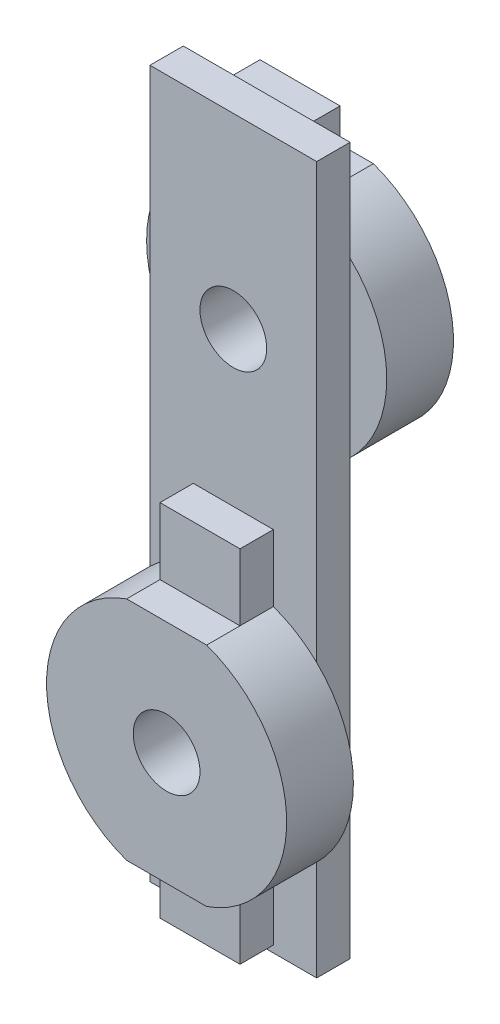
ISO-10303-21;
HEADER;
FILE_DESCRIPTION(('STEP AP214'),'2;1');
FILE_NAME('part.step','',(''),(''),'','','');
FILE_SCHEMA(('AUTOMOTIVE_DESIGN { 1 0 10303 214 1 1 1 1 }'));
ENDSEC;
DATA;
#1=APPLICATION_CONTEXT('core data for automotive mechanical design processes');
#2=APPLICATION_PROTOCOL_DEFINITION('international standard','automotive_design',2000,#1);
#3=PRODUCT_CONTEXT('',#1,'mechanical');
#4=PRODUCT('Part','Part','',(#3));
#5=PRODUCT_RELATED_PRODUCT_CATEGORY('part','',(#4));
#6=PRODUCT_DEFINITION_FORMATION('','',#4);
#7=PRODUCT_DEFINITION_CONTEXT('part definition',#1,'design');
#8=PRODUCT_DEFINITION('design','',#6,#7);
#9=PRODUCT_DEFINITION_SHAPE('','',#8);
#10=(LENGTH_UNIT() NAMED_UNIT(*) SI_UNIT(.MILLI.,.METRE.));
#11=(NAMED_UNIT(*) PLANE_ANGLE_UNIT() SI_UNIT($,.RADIAN.));
#12=(NAMED_UNIT(*) SI_UNIT($,.STERADIAN.) SOLID_ANGLE_UNIT());
#13=UNCERTAINTY_MEASURE_WITH_UNIT(LENGTH_MEASURE(1.E-05),#10,'distance_accuracy_value','');
#14=(GEOMETRIC_REPRESENTATION_CONTEXT(3) GLOBAL_UNCERTAINTY_ASSIGNED_CONTEXT((#13)) GLOBAL_UNIT_ASSIGNED_CONTEXT((#10,
#11,#12)) REPRESENTATION_CONTEXT('',''));
#15=CARTESIAN_POINT('',(0.,0.,0.));
#16=DIRECTION('',(0.,0.,1.));
#17=DIRECTION('',(1.,0.,0.));
#18=AXIS2_PLACEMENT_3D('',#15,#16,#17);
#19=CARTESIAN_POINT('',(0.,0.,0.));
#20=DIRECTION('',(0.,0.,1.));
#21=DIRECTION('',(1.,0.,0.));
#22=AXIS2_PLACEMENT_3D('',#19,#20,#21);
#23=PLANE('',#22);
#24=CARTESIAN_POINT('',(0.,-22.,0.));
#25=DIRECTION('',(0.,0.,-1.));
#26=DIRECTION('',(-1.,0.,0.));
#27=AXIS2_PLACEMENT_3D('',#24,#25,#26);
#28=CIRCLE('',#27,5.);
#29=CARTESIAN_POINT('',(-5.,-22.,0.));
#30=VERTEX_POINT('',#29);
#31=EDGE_CURVE('E478',#30,#30,#28,.T.);
#32=ORIENTED_EDGE('',*,*,#31,.F.);
#33=EDGE_LOOP('',(#32));
#34=FACE_BOUND('',#33,.T.);
#35=CARTESIAN_POINT('',(0.,28.,0.));
#36=DIRECTION('',(0.,0.,-1.));
#37=DIRECTION('',(-1.,0.,0.));
#38=AXIS2_PLACEMENT_3D('',#35,#36,#37);
#39=CIRCLE('',#38,18.);
#40=CARTESIAN_POINT('',(12.5,15.0481661530114,0.));
#41=VERTEX_POINT('',#40);
#42=CARTESIAN_POINT('',(6.,11.0294372515229,0.));
#43=VERTEX_POINT('',#42);
#44=EDGE_CURVE('E12',#41,#43,#39,.T.);
#45=ORIENTED_EDGE('',*,*,#44,.F.);
#46=DIRECTION('',(0.,1.,0.));
#47=VECTOR('',#46,1.);
#48=CARTESIAN_POINT('',(12.5,56.,0.));
#49=LINE('',#48,#47);
#50=CARTESIAN_POINT('',(12.5,-50.,0.));
#51=VERTEX_POINT('',#50);
#52=EDGE_CURVE('E341',#51,#41,#49,.T.);
#53=ORIENTED_EDGE('',*,*,#52,.F.);
#54=DIRECTION('',(1.,0.,0.));
#55=VECTOR('',#54,1.);
#56=CARTESIAN_POINT('',(-12.5,-50.,0.));
#57=LINE('',#56,#55);
#58=CARTESIAN_POINT('',(-12.5,-50.,0.));
#59=VERTEX_POINT('',#58);
#60=EDGE_CURVE('E351',#59,#51,#57,.T.);
#61=ORIENTED_EDGE('',*,*,#60,.F.);
#62=DIRECTION('',(0.,-1.,0.));
#63=VECTOR('',#62,1.);
#64=CARTESIAN_POINT('',(-12.5,56.,0.));
#65=LINE('',#64,#63);
#66=CARTESIAN_POINT('',(-12.5,15.0481661530114,0.));
#67=VERTEX_POINT('',#66);
#68=EDGE_CURVE('E347',#67,#59,#65,.T.);
#69=ORIENTED_EDGE('',*,*,#68,.F.);
#70=CARTESIAN_POINT('',(0.,28.,0.));
#71=DIRECTION('',(0.,0.,-1.));
#72=DIRECTION('',(-1.,0.,0.));
#73=AXIS2_PLACEMENT_3D('',#70,#71,#72);
#74=CIRCLE('',#73,18.);
#75=CARTESIAN_POINT('',(-6.,11.0294372515229,0.));
#76=VERTEX_POINT('',#75);
#77=EDGE_CURVE('E511',#76,#67,#74,.T.);
#78=ORIENTED_EDGE('',*,*,#77,.F.);
#79=DIRECTION('',(0.,-1.,0.));
#80=VECTOR('',#79,1.);
#81=CARTESIAN_POINT('',(-6.,0.,0.));
#82=LINE('',#81,#80);
#83=CARTESIAN_POINT('',(-6.,1.02943725152286,0.));
#84=VERTEX_POINT('',#83);
#85=EDGE_CURVE('E494',#76,#84,#82,.T.);
#86=ORIENTED_EDGE('',*,*,#85,.T.);
#87=DIRECTION('',(1.,0.,0.));
#88=VECTOR('',#87,1.);
#89=CARTESIAN_POINT('',(0.,1.02943725152286,0.));
#90=LINE('',#89,#88);
#91=CARTESIAN_POINT('',(6.,1.02943725152286,0.));
#92=VERTEX_POINT('',#91);
#93=EDGE_CURVE('E501',#84,#92,#90,.T.);
#94=ORIENTED_EDGE('',*,*,#93,.T.);
#95=DIRECTION('',(0.,1.,0.));
#96=VECTOR('',#95,1.);
#97=CARTESIAN_POINT('',(6.,0.,0.));
#98=LINE('',#97,#96);
#99=EDGE_CURVE('E524',#92,#43,#98,.T.);
#100=ORIENTED_EDGE('',*,*,#99,.T.);
#101=EDGE_LOOP('',(#45,#53,#61,#69,#78,#86,#94,#100));
#102=FACE_BOUND('',#101,.T.);
#103=ADVANCED_FACE('F95',(#34,#102),#23,.F.);
#104=CARTESIAN_POINT('',(0.,0.,5.));
#105=DIRECTION('',(0.,0.,1.));
#106=DIRECTION('',(1.,0.,0.));
#107=AXIS2_PLACEMENT_3D('',#104,#105,#106);
#108=PLANE('',#107);
#109=CARTESIAN_POINT('',(0.,-22.,5.));
#110=DIRECTION('',(0.,0.,1.));
#111=DIRECTION('',(1.,0.,0.));
#112=AXIS2_PLACEMENT_3D('',#109,#110,#111);
#113=CIRCLE('',#112,18.);
#114=CARTESIAN_POINT('',(6.00000000000001,-38.9705627484771,5.));
#115=VERTEX_POINT('',#114);
#116=CARTESIAN_POINT('',(12.5,-34.9518338469886,5.));
#117=VERTEX_POINT('',#116);
#118=EDGE_CURVE('E372',#115,#117,#113,.T.);
#119=ORIENTED_EDGE('',*,*,#118,.F.);
#120=DIRECTION('',(0.,1.,0.));
#121=VECTOR('',#120,1.);
#122=CARTESIAN_POINT('',(6.00000000000001,0.,5.));
#123=LINE('',#122,#121);
#124=CARTESIAN_POINT('',(6.00000000000001,-48.9705627484771,5.));
#125=VERTEX_POINT('',#124);
#126=EDGE_CURVE('E401',#125,#115,#123,.T.);
#127=ORIENTED_EDGE('',*,*,#126,.F.);
#128=DIRECTION('',(1.,0.,0.));
#129=VECTOR('',#128,1.);
#130=CARTESIAN_POINT('',(0.,-48.9705627484771,5.));
#131=LINE('',#130,#129);
#132=CARTESIAN_POINT('',(-5.99999999999998,-48.9705627484771,5.));
#133=VERTEX_POINT('',#132);
#134=EDGE_CURVE('E446',#133,#125,#131,.T.);
#135=ORIENTED_EDGE('',*,*,#134,.F.);
#136=DIRECTION('',(0.,-1.,0.));
#137=VECTOR('',#136,1.);
#138=CARTESIAN_POINT('',(-5.99999999999998,0.,5.));
#139=LINE('',#138,#137);
#140=CARTESIAN_POINT('',(-5.99999999999998,-38.9705627484771,5.));
#141=VERTEX_POINT('',#140);
#142=EDGE_CURVE('E442',#141,#133,#139,.T.);
#143=ORIENTED_EDGE('',*,*,#142,.F.);
#144=CARTESIAN_POINT('',(0.,-22.,5.));
#145=DIRECTION('',(0.,0.,1.));
#146=DIRECTION('',(1.,0.,0.));
#147=AXIS2_PLACEMENT_3D('',#144,#145,#146);
#148=CIRCLE('',#147,18.);
#149=CARTESIAN_POINT('',(-12.5,-34.9518338469886,5.));
#150=VERTEX_POINT('',#149);
#151=EDGE_CURVE('E370',#150,#141,#148,.T.);
#152=ORIENTED_EDGE('',*,*,#151,.F.);
#153=DIRECTION('',(0.,-1.,0.));
#154=VECTOR('',#153,1.);
#155=CARTESIAN_POINT('',(-12.5,56.,5.));
#156=LINE('',#155,#154);
#157=CARTESIAN_POINT('',(-12.5,-50.,5.));
#158=VERTEX_POINT('',#157);
#159=EDGE_CURVE('E333',#150,#158,#156,.T.);
#160=ORIENTED_EDGE('',*,*,#159,.T.);
#161=DIRECTION('',(1.,0.,0.));
#162=VECTOR('',#161,1.);
#163=CARTESIAN_POINT('',(-12.5,-50.,5.));
#164=LINE('',#163,#162);
#165=CARTESIAN_POINT('',(12.5,-50.,5.));
#166=VERTEX_POINT('',#165);
#167=EDGE_CURVE('E337',#158,#166,#164,.T.);
#168=ORIENTED_EDGE('',*,*,#167,.T.);
#169=DIRECTION('',(0.,1.,0.));
#170=VECTOR('',#169,1.);
#171=CARTESIAN_POINT('',(12.5,56.,5.));
#172=LINE('',#171,#170);
#173=EDGE_CURVE('E326',#166,#117,#172,.T.);
#174=ORIENTED_EDGE('',*,*,#173,.T.);
#175=EDGE_LOOP('',(#119,#127,#135,#143,#152,#160,#168,#174));
#176=FACE_BOUND('',#175,.T.);
#177=ADVANCED_FACE('F444',(#176),#108,.T.);
#178=CARTESIAN_POINT('',(12.5,56.,5.));
#179=DIRECTION('',(-1.,0.,0.));
#180=DIRECTION('',(0.,-1.,0.));
#181=AXIS2_PLACEMENT_3D('',#178,#179,#180);
#182=PLANE('',#181);
#183=ORIENTED_EDGE('',*,*,#52,.T.);
#184=CARTESIAN_POINT('',(12.5,40.9518338469886,0.));
#185=VERTEX_POINT('',#184);
#186=EDGE_CURVE('E345',#41,#185,#49,.T.);
#187=ORIENTED_EDGE('',*,*,#186,.T.);
#188=CARTESIAN_POINT('',(12.5,56.,0.));
#189=VERTEX_POINT('',#188);
#190=EDGE_CURVE('E325',#185,#189,#49,.T.);
#191=ORIENTED_EDGE('',*,*,#190,.T.);
#192=DIRECTION('',(0.,0.,-1.));
#193=VECTOR('',#192,1.);
#194=CARTESIAN_POINT('',(12.5,56.,5.));
#195=LINE('',#194,#193);
#196=CARTESIAN_POINT('',(12.5,56.,5.));
#197=VERTEX_POINT('',#196);
#198=EDGE_CURVE('E99',#197,#189,#195,.T.);
#199=ORIENTED_EDGE('',*,*,#198,.F.);
#200=CARTESIAN_POINT('',(12.5,-9.04816615301135,5.));
#201=VERTEX_POINT('',#200);
#202=EDGE_CURVE('E331',#201,#197,#172,.T.);
#203=ORIENTED_EDGE('',*,*,#202,.F.);
#204=EDGE_CURVE('E330',#117,#201,#172,.T.);
#205=ORIENTED_EDGE('',*,*,#204,.F.);
#206=ORIENTED_EDGE('',*,*,#173,.F.);
#207=DIRECTION('',(0.,0.,-1.));
#208=VECTOR('',#207,1.);
#209=CARTESIAN_POINT('',(12.5,-50.,5.));
#210=LINE('',#209,#208);
#211=EDGE_CURVE('E340',#166,#51,#210,.T.);
#212=ORIENTED_EDGE('',*,*,#211,.T.);
#213=EDGE_LOOP('',(#183,#187,#191,#199,#203,#205,#206,#212));
#214=FACE_BOUND('',#213,.T.);
#215=ADVANCED_FACE('F97',(#214),#182,.F.);
#216=CARTESIAN_POINT('',(-12.5,56.,5.));
#217=DIRECTION('',(0.,-1.,0.));
#218=DIRECTION('',(0.,0.,-1.));
#219=AXIS2_PLACEMENT_3D('',#216,#217,#218);
#220=PLANE('',#219);
#221=DIRECTION('',(-1.,0.,0.));
#222=VECTOR('',#221,1.);
#223=CARTESIAN_POINT('',(-12.5,56.,0.));
#224=LINE('',#223,#222);
#225=CARTESIAN_POINT('',(-12.5,56.,0.));
#226=VERTEX_POINT('',#225);
#227=EDGE_CURVE('E344',#189,#226,#224,.T.);
#228=ORIENTED_EDGE('',*,*,#227,.T.);
#229=DIRECTION('',(0.,0.,-1.));
#230=VECTOR('',#229,1.);
#231=CARTESIAN_POINT('',(-12.5,56.,5.));
#232=LINE('',#231,#230);
#233=CARTESIAN_POINT('',(-12.5,56.,5.));
#234=VERTEX_POINT('',#233);
#235=EDGE_CURVE('E358',#234,#226,#232,.T.);
#236=ORIENTED_EDGE('',*,*,#235,.F.);
#237=DIRECTION('',(-1.,0.,0.));
#238=VECTOR('',#237,1.);
#239=CARTESIAN_POINT('',(-12.5,56.,5.));
#240=LINE('',#239,#238);
#241=EDGE_CURVE('E329',#197,#234,#240,.T.);
#242=ORIENTED_EDGE('',*,*,#241,.F.);
#243=ORIENTED_EDGE('',*,*,#198,.T.);
#244=EDGE_LOOP('',(#228,#236,#242,#243));
#245=FACE_BOUND('',#244,.T.);
#246=ADVANCED_FACE('F944',(#245),#220,.F.);
#247=CARTESIAN_POINT('',(-12.5,56.,5.));
#248=DIRECTION('',(1.,0.,0.));
#249=DIRECTION('',(0.,1.,0.));
#250=AXIS2_PLACEMENT_3D('',#247,#248,#249);
#251=PLANE('',#250);
#252=CARTESIAN_POINT('',(-12.5,40.9518338469886,0.));
#253=VERTEX_POINT('',#252);
#254=EDGE_CURVE('E348',#226,#253,#65,.T.);
#255=ORIENTED_EDGE('',*,*,#254,.T.);
#256=EDGE_CURVE('E352',#253,#67,#65,.T.);
#257=ORIENTED_EDGE('',*,*,#256,.T.);
#258=ORIENTED_EDGE('',*,*,#68,.T.);
#259=DIRECTION('',(0.,0.,-1.));
#260=VECTOR('',#259,1.);
#261=CARTESIAN_POINT('',(-12.5,-50.,5.));
#262=LINE('',#261,#260);
#263=EDGE_CURVE('E356',#158,#59,#262,.T.);
#264=ORIENTED_EDGE('',*,*,#263,.F.);
#265=ORIENTED_EDGE('',*,*,#159,.F.);
#266=CARTESIAN_POINT('',(-12.5,-9.04816615301139,5.));
#267=VERTEX_POINT('',#266);
#268=EDGE_CURVE('E338',#267,#150,#156,.T.);
#269=ORIENTED_EDGE('',*,*,#268,.F.);
#270=EDGE_CURVE('E334',#234,#267,#156,.T.);
#271=ORIENTED_EDGE('',*,*,#270,.F.);
#272=ORIENTED_EDGE('',*,*,#235,.T.);
#273=EDGE_LOOP('',(#255,#257,#258,#264,#265,#269,#271,#272));
#274=FACE_BOUND('',#273,.T.);
#275=ADVANCED_FACE('F569',(#274),#251,.F.);
#276=CARTESIAN_POINT('',(-12.5,-50.,5.));
#277=DIRECTION('',(0.,1.,0.));
#278=DIRECTION('',(0.,0.,1.));
#279=AXIS2_PLACEMENT_3D('',#276,#277,#278);
#280=PLANE('',#279);
#281=ORIENTED_EDGE('',*,*,#60,.T.);
#282=ORIENTED_EDGE('',*,*,#211,.F.);
#283=ORIENTED_EDGE('',*,*,#167,.F.);
#284=ORIENTED_EDGE('',*,*,#263,.T.);
#285=EDGE_LOOP('',(#281,#282,#283,#284));
#286=FACE_BOUND('',#285,.T.);
#287=ADVANCED_FACE('F578',(#286),#280,.F.);
#288=CARTESIAN_POINT('',(0.,28.,5.));
#289=DIRECTION('',(0.,0.,-1.));
#290=DIRECTION('',(-1.,0.,0.));
#291=AXIS2_PLACEMENT_3D('',#288,#289,#290);
#292=CIRCLE('',#291,5.);
#293=CARTESIAN_POINT('',(-5.,28.,5.));
#294=VERTEX_POINT('',#293);
#295=EDGE_CURVE('E491',#294,#294,#292,.T.);
#296=ORIENTED_EDGE('',*,*,#295,.T.);
#297=EDGE_LOOP('',(#296));
#298=FACE_BOUND('',#297,.T.);
#299=CARTESIAN_POINT('',(6.00000000000001,-5.02943725152285,5.));
#300=VERTEX_POINT('',#299);
#301=EDGE_CURVE('E365',#201,#300,#113,.T.);
#302=ORIENTED_EDGE('',*,*,#301,.F.);
#303=ORIENTED_EDGE('',*,*,#202,.T.);
#304=ORIENTED_EDGE('',*,*,#241,.T.);
#305=ORIENTED_EDGE('',*,*,#270,.T.);
#306=CARTESIAN_POINT('',(-5.99999999999998,-5.02943725152285,5.));
#307=VERTEX_POINT('',#306);
#308=EDGE_CURVE('E381',#307,#267,#148,.T.);
#309=ORIENTED_EDGE('',*,*,#308,.F.);
#310=DIRECTION('',(0.,-1.,0.));
#311=VECTOR('',#310,1.);
#312=CARTESIAN_POINT('',(-5.99999999999999,0.,5.));
#313=LINE('',#312,#311);
#314=CARTESIAN_POINT('',(-5.99999999999999,4.97056274847716,5.));
#315=VERTEX_POINT('',#314);
#316=EDGE_CURVE('E305',#315,#307,#313,.T.);
#317=ORIENTED_EDGE('',*,*,#316,.F.);
#318=DIRECTION('',(1.,0.,0.));
#319=VECTOR('',#318,1.);
#320=CARTESIAN_POINT('',(0.,4.97056274847716,5.));
#321=LINE('',#320,#319);
#322=CARTESIAN_POINT('',(6.00000000000001,4.97056274847716,5.));
#323=VERTEX_POINT('',#322);
#324=EDGE_CURVE('E450',#315,#323,#321,.T.);
#325=ORIENTED_EDGE('',*,*,#324,.T.);
#326=DIRECTION('',(0.,-1.,0.));
#327=VECTOR('',#326,1.);
#328=CARTESIAN_POINT('',(6.00000000000001,0.,5.));
#329=LINE('',#328,#327);
#330=EDGE_CURVE('E386',#323,#300,#329,.T.);
#331=ORIENTED_EDGE('',*,*,#330,.T.);
#332=EDGE_LOOP('',(#302,#303,#304,#305,#309,#317,#325,#331));
#333=FACE_BOUND('',#332,.T.);
#334=ADVANCED_FACE('F454',(#298,#333),#108,.T.);
#335=CARTESIAN_POINT('',(6.,44.9705627484771,0.));
#336=VERTEX_POINT('',#335);
#337=EDGE_CURVE('E106',#336,#185,#39,.T.);
#338=ORIENTED_EDGE('',*,*,#337,.F.);
#339=DIRECTION('',(0.,1.,0.));
#340=VECTOR('',#339,1.);
#341=CARTESIAN_POINT('',(6.,0.,0.));
#342=LINE('',#341,#340);
#343=CARTESIAN_POINT('',(6.,54.9705627484771,0.));
#344=VERTEX_POINT('',#343);
#345=EDGE_CURVE('E520',#336,#344,#342,.T.);
#346=ORIENTED_EDGE('',*,*,#345,.T.);
#347=DIRECTION('',(-1.,0.,0.));
#348=VECTOR('',#347,1.);
#349=CARTESIAN_POINT('',(0.,54.9705627484771,0.));
#350=LINE('',#349,#348);
#351=CARTESIAN_POINT('',(-6.00000000000003,54.9705627484771,0.));
#352=VERTEX_POINT('',#351);
#353=EDGE_CURVE('E517',#344,#352,#350,.T.);
#354=ORIENTED_EDGE('',*,*,#353,.T.);
#355=DIRECTION('',(0.,-1.,0.));
#356=VECTOR('',#355,1.);
#357=CARTESIAN_POINT('',(-6.00000000000003,0.,0.));
#358=LINE('',#357,#356);
#359=CARTESIAN_POINT('',(-6.00000000000003,44.9705627484771,0.));
#360=VERTEX_POINT('',#359);
#361=EDGE_CURVE('E514',#352,#360,#358,.T.);
#362=ORIENTED_EDGE('',*,*,#361,.T.);
#363=EDGE_CURVE('E104',#253,#360,#74,.T.);
#364=ORIENTED_EDGE('',*,*,#363,.F.);
#365=ORIENTED_EDGE('',*,*,#254,.F.);
#366=ORIENTED_EDGE('',*,*,#227,.F.);
#367=ORIENTED_EDGE('',*,*,#190,.F.);
#368=EDGE_LOOP('',(#338,#346,#354,#362,#364,#365,#366,#367));
#369=FACE_BOUND('',#368,.T.);
#370=ADVANCED_FACE('F565',(#369),#23,.F.);
#371=CARTESIAN_POINT('',(0.,0.,5.));
#372=DIRECTION('',(0.,0.,1.));
#373=DIRECTION('',(1.,0.,0.));
#374=AXIS2_PLACEMENT_3D('',#371,#372,#373);
#375=PLANE('',#374);
#376=EDGE_CURVE('E373',#117,#201,#113,.T.);
#377=ORIENTED_EDGE('',*,*,#376,.F.);
#378=ORIENTED_EDGE('',*,*,#204,.T.);
#379=EDGE_LOOP('',(#377,#378));
#380=FACE_BOUND('',#379,.T.);
#381=ADVANCED_FACE('F615',(#380),#375,.F.);
#382=EDGE_CURVE('E382',#267,#150,#148,.T.);
#383=ORIENTED_EDGE('',*,*,#382,.F.);
#384=ORIENTED_EDGE('',*,*,#268,.T.);
#385=EDGE_LOOP('',(#383,#384));
#386=FACE_BOUND('',#385,.T.);
#387=ADVANCED_FACE('F620',(#386),#375,.F.);
#388=CARTESIAN_POINT('',(0.,-22.,15.));
#389=DIRECTION('',(0.,0.,-1.));
#390=DIRECTION('',(-1.,0.,0.));
#391=AXIS2_PLACEMENT_3D('',#388,#389,#390);
#392=CYLINDRICAL_SURFACE('',#391,5.);
#393=CARTESIAN_POINT('',(0.,-22.,15.));
#394=DIRECTION('',(0.,0.,1.));
#395=DIRECTION('',(1.,0.,0.));
#396=AXIS2_PLACEMENT_3D('',#393,#394,#395);
#397=CIRCLE('',#396,5.);
#398=CARTESIAN_POINT('',(5.00000000000002,-22.,15.));
#399=VERTEX_POINT('',#398);
#400=EDGE_CURVE('E397',#399,#399,#397,.T.);
#401=ORIENTED_EDGE('',*,*,#400,.T.);
#402=EDGE_LOOP('',(#401));
#403=FACE_BOUND('',#402,.T.);
#404=ORIENTED_EDGE('',*,*,#31,.T.);
#405=EDGE_LOOP('',(#404));
#406=FACE_BOUND('',#405,.T.);
#407=ADVANCED_FACE('F628',(#403,#406),#392,.F.);
#408=CARTESIAN_POINT('',(0.,-22.,15.));
#409=DIRECTION('',(0.,0.,-1.));
#410=DIRECTION('',(-1.,0.,0.));
#411=AXIS2_PLACEMENT_3D('',#408,#409,#410);
#412=CYLINDRICAL_SURFACE('',#411,18.);
#413=ORIENTED_EDGE('',*,*,#118,.T.);
#414=ORIENTED_EDGE('',*,*,#376,.T.);
#415=ORIENTED_EDGE('',*,*,#301,.T.);
#416=DIRECTION('',(0.,0.,-1.));
#417=VECTOR('',#416,1.);
#418=CARTESIAN_POINT('',(6.00000000000001,-5.02943725152285,15.));
#419=LINE('',#418,#417);
#420=CARTESIAN_POINT('',(6.00000000000001,-5.02943725152285,10.));
#421=VERTEX_POINT('',#420);
#422=EDGE_CURVE('E323',#421,#300,#419,.T.);
#423=ORIENTED_EDGE('',*,*,#422,.F.);
#424=CARTESIAN_POINT('',(6.00000000000001,-5.02943725152285,15.));
#425=VERTEX_POINT('',#424);
#426=EDGE_CURVE('E290',#425,#421,#419,.T.);
#427=ORIENTED_EDGE('',*,*,#426,.F.);
#428=CARTESIAN_POINT('',(0.,-22.,15.));
#429=DIRECTION('',(0.,0.,1.));
#430=DIRECTION('',(1.,0.,0.));
#431=AXIS2_PLACEMENT_3D('',#428,#429,#430);
#432=CIRCLE('',#431,18.);
#433=CARTESIAN_POINT('',(6.00000000000001,-38.9705627484771,15.));
#434=VERTEX_POINT('',#433);
#435=EDGE_CURVE('E400',#434,#425,#432,.T.);
#436=ORIENTED_EDGE('',*,*,#435,.F.);
#437=DIRECTION('',(0.,0.,-1.));
#438=VECTOR('',#437,1.);
#439=CARTESIAN_POINT('',(6.00000000000001,-38.9705627484771,15.));
#440=LINE('',#439,#438);
#441=CARTESIAN_POINT('',(6.00000000000001,-38.9705627484771,10.));
#442=VERTEX_POINT('',#441);
#443=EDGE_CURVE('E406',#434,#442,#440,.T.);
#444=ORIENTED_EDGE('',*,*,#443,.T.);
#445=EDGE_CURVE('E403',#442,#115,#440,.T.);
#446=ORIENTED_EDGE('',*,*,#445,.T.);
#447=EDGE_LOOP('',(#413,#414,#415,#423,#427,#436,#444,#446));
#448=FACE_BOUND('',#447,.T.);
#449=ADVANCED_FACE('F460',(#448),#412,.T.);
#450=CARTESIAN_POINT('',(0.,-22.,15.));
#451=DIRECTION('',(0.,0.,-1.));
#452=DIRECTION('',(-1.,0.,0.));
#453=AXIS2_PLACEMENT_3D('',#450,#451,#452);
#454=CYLINDRICAL_SURFACE('',#453,18.);
#455=ORIENTED_EDGE('',*,*,#308,.T.);
#456=ORIENTED_EDGE('',*,*,#382,.T.);
#457=ORIENTED_EDGE('',*,*,#151,.T.);
#458=DIRECTION('',(0.,0.,-1.));
#459=VECTOR('',#458,1.);
#460=CARTESIAN_POINT('',(-5.99999999999998,-38.9705627484771,15.));
#461=LINE('',#460,#459);
#462=CARTESIAN_POINT('',(-5.99999999999998,-38.9705627484771,10.));
#463=VERTEX_POINT('',#462);
#464=EDGE_CURVE('E416',#463,#141,#461,.T.);
#465=ORIENTED_EDGE('',*,*,#464,.F.);
#466=CARTESIAN_POINT('',(-5.99999999999998,-38.9705627484771,15.));
#467=VERTEX_POINT('',#466);
#468=EDGE_CURVE('E309',#467,#463,#461,.T.);
#469=ORIENTED_EDGE('',*,*,#468,.F.);
#470=CARTESIAN_POINT('',(0.,-22.,15.));
#471=DIRECTION('',(0.,0.,1.));
#472=DIRECTION('',(1.,0.,0.));
#473=AXIS2_PLACEMENT_3D('',#470,#471,#472);
#474=CIRCLE('',#473,18.);
#475=CARTESIAN_POINT('',(-5.99999999999998,-5.02943725152285,15.));
#476=VERTEX_POINT('',#475);
#477=EDGE_CURVE('E315',#476,#467,#474,.T.);
#478=ORIENTED_EDGE('',*,*,#477,.F.);
#479=DIRECTION('',(0.,0.,-1.));
#480=VECTOR('',#479,1.);
#481=CARTESIAN_POINT('',(-5.99999999999998,-5.02943725152285,15.));
#482=LINE('',#481,#480);
#483=CARTESIAN_POINT('',(-5.99999999999998,-5.02943725152285,10.));
#484=VERTEX_POINT('',#483);
#485=EDGE_CURVE('E287',#476,#484,#482,.T.);
#486=ORIENTED_EDGE('',*,*,#485,.T.);
#487=EDGE_CURVE('E302',#484,#307,#482,.T.);
#488=ORIENTED_EDGE('',*,*,#487,.T.);
#489=EDGE_LOOP('',(#455,#456,#457,#465,#469,#478,#486,#488));
#490=FACE_BOUND('',#489,.T.);
#491=ADVANCED_FACE('F312',(#490),#454,.T.);
#492=CARTESIAN_POINT('',(0.,0.,15.));
#493=DIRECTION('',(0.,0.,1.));
#494=DIRECTION('',(1.,0.,0.));
#495=AXIS2_PLACEMENT_3D('',#492,#493,#494);
#496=PLANE('',#495);
#497=DIRECTION('',(1.,0.,0.));
#498=VECTOR('',#497,1.);
#499=CARTESIAN_POINT('',(6.00000000000001,-5.02943725152285,15.));
#500=LINE('',#499,#498);
#501=EDGE_CURVE('E299',#476,#425,#500,.T.);
#502=ORIENTED_EDGE('',*,*,#501,.F.);
#503=ORIENTED_EDGE('',*,*,#477,.T.);
#504=DIRECTION('',(-1.,0.,0.));
#505=VECTOR('',#504,1.);
#506=CARTESIAN_POINT('',(-5.99999999999998,-38.9705627484771,15.));
#507=LINE('',#506,#505);
#508=EDGE_CURVE('E429',#434,#467,#507,.T.);
#509=ORIENTED_EDGE('',*,*,#508,.F.);
#510=ORIENTED_EDGE('',*,*,#435,.T.);
#511=EDGE_LOOP('',(#502,#503,#509,#510));
#512=FACE_BOUND('',#511,.T.);
#513=ORIENTED_EDGE('',*,*,#400,.F.);
#514=EDGE_LOOP('',(#513));
#515=FACE_BOUND('',#514,.T.);
#516=ADVANCED_FACE('F462',(#512,#515),#496,.T.);
#517=CARTESIAN_POINT('',(6.00000000000001,0.,15.));
#518=DIRECTION('',(1.,0.,0.));
#519=DIRECTION('',(0.,1.,0.));
#520=AXIS2_PLACEMENT_3D('',#517,#518,#519);
#521=PLANE('',#520);
#522=DIRECTION('',(0.,1.,0.));
#523=VECTOR('',#522,1.);
#524=CARTESIAN_POINT('',(6.00000000000001,4.97056274847716,10.));
#525=LINE('',#524,#523);
#526=CARTESIAN_POINT('',(6.00000000000001,4.97056274847716,10.));
#527=VERTEX_POINT('',#526);
#528=EDGE_CURVE('E292',#421,#527,#525,.T.);
#529=ORIENTED_EDGE('',*,*,#528,.F.);
#530=ORIENTED_EDGE('',*,*,#422,.T.);
#531=ORIENTED_EDGE('',*,*,#330,.F.);
#532=DIRECTION('',(0.,0.,-1.));
#533=VECTOR('',#532,1.);
#534=CARTESIAN_POINT('',(6.00000000000001,4.97056274847716,15.));
#535=LINE('',#534,#533);
#536=EDGE_CURVE('E317',#527,#323,#535,.T.);
#537=ORIENTED_EDGE('',*,*,#536,.F.);
#538=EDGE_LOOP('',(#529,#530,#531,#537));
#539=FACE_BOUND('',#538,.T.);
#540=ADVANCED_FACE('F459',(#539),#521,.T.);
#541=CARTESIAN_POINT('',(0.,4.97056274847716,15.));
#542=DIRECTION('',(0.,1.,0.));
#543=DIRECTION('',(0.,0.,1.));
#544=AXIS2_PLACEMENT_3D('',#541,#542,#543);
#545=PLANE('',#544);
#546=DIRECTION('',(-1.,0.,0.));
#547=VECTOR('',#546,1.);
#548=CARTESIAN_POINT('',(-5.99999999999999,4.97056274847716,10.));
#549=LINE('',#548,#547);
#550=CARTESIAN_POINT('',(-5.99999999999999,4.97056274847716,10.));
#551=VERTEX_POINT('',#550);
#552=EDGE_CURVE('E114',#527,#551,#549,.T.);
#553=ORIENTED_EDGE('',*,*,#552,.F.);
#554=ORIENTED_EDGE('',*,*,#536,.T.);
#555=ORIENTED_EDGE('',*,*,#324,.F.);
#556=DIRECTION('',(0.,0.,-1.));
#557=VECTOR('',#556,1.);
#558=CARTESIAN_POINT('',(-5.99999999999999,4.97056274847716,15.));
#559=LINE('',#558,#557);
#560=EDGE_CURVE('E316',#551,#315,#559,.T.);
#561=ORIENTED_EDGE('',*,*,#560,.F.);
#562=EDGE_LOOP('',(#553,#554,#555,#561));
#563=FACE_BOUND('',#562,.T.);
#564=ADVANCED_FACE('F636',(#563),#545,.T.);
#565=CARTESIAN_POINT('',(-5.99999999999999,0.,15.));
#566=DIRECTION('',(1.,0.,0.));
#567=DIRECTION('',(0.,1.,0.));
#568=AXIS2_PLACEMENT_3D('',#565,#566,#567);
#569=PLANE('',#568);
#570=ORIENTED_EDGE('',*,*,#487,.F.);
#571=DIRECTION('',(0.,-1.,0.));
#572=VECTOR('',#571,1.);
#573=CARTESIAN_POINT('',(-5.99999999999998,-5.02943725152285,10.));
#574=LINE('',#573,#572);
#575=EDGE_CURVE('E293',#551,#484,#574,.T.);
#576=ORIENTED_EDGE('',*,*,#575,.F.);
#577=ORIENTED_EDGE('',*,*,#560,.T.);
#578=ORIENTED_EDGE('',*,*,#316,.T.);
#579=EDGE_LOOP('',(#570,#576,#577,#578));
#580=FACE_BOUND('',#579,.T.);
#581=ADVANCED_FACE('F303',(#580),#569,.F.);
#582=CARTESIAN_POINT('',(-5.99999999999998,0.,15.));
#583=DIRECTION('',(1.,0.,0.));
#584=DIRECTION('',(0.,1.,0.));
#585=AXIS2_PLACEMENT_3D('',#582,#583,#584);
#586=PLANE('',#585);
#587=DIRECTION('',(0.,0.,-1.));
#588=VECTOR('',#587,1.);
#589=CARTESIAN_POINT('',(-5.99999999999998,-48.9705627484771,15.));
#590=LINE('',#589,#588);
#591=CARTESIAN_POINT('',(-5.99999999999998,-48.9705627484771,10.));
#592=VERTEX_POINT('',#591);
#593=EDGE_CURVE('E415',#592,#133,#590,.T.);
#594=ORIENTED_EDGE('',*,*,#593,.F.);
#595=DIRECTION('',(0.,-1.,0.));
#596=VECTOR('',#595,1.);
#597=CARTESIAN_POINT('',(-5.99999999999998,-48.9705627484771,10.));
#598=LINE('',#597,#596);
#599=EDGE_CURVE('E431',#463,#592,#598,.T.);
#600=ORIENTED_EDGE('',*,*,#599,.F.);
#601=ORIENTED_EDGE('',*,*,#464,.T.);
#602=ORIENTED_EDGE('',*,*,#142,.T.);
#603=EDGE_LOOP('',(#594,#600,#601,#602));
#604=FACE_BOUND('',#603,.T.);
#605=ADVANCED_FACE('F434',(#604),#586,.F.);
#606=CARTESIAN_POINT('',(0.,-48.9705627484771,15.));
#607=DIRECTION('',(0.,1.,0.));
#608=DIRECTION('',(-1.,0.,0.));
#609=AXIS2_PLACEMENT_3D('',#606,#607,#608);
#610=PLANE('',#609);
#611=DIRECTION('',(0.,0.,-1.));
#612=VECTOR('',#611,1.);
#613=CARTESIAN_POINT('',(6.00000000000001,-48.9705627484771,15.));
#614=LINE('',#613,#612);
#615=CARTESIAN_POINT('',(6.00000000000001,-48.9705627484771,10.));
#616=VERTEX_POINT('',#615);
#617=EDGE_CURVE('E411',#616,#125,#614,.T.);
#618=ORIENTED_EDGE('',*,*,#617,.F.);
#619=DIRECTION('',(1.,0.,0.));
#620=VECTOR('',#619,1.);
#621=CARTESIAN_POINT('',(6.00000000000001,-48.9705627484771,10.));
#622=LINE('',#621,#620);
#623=EDGE_CURVE('E122',#592,#616,#622,.T.);
#624=ORIENTED_EDGE('',*,*,#623,.F.);
#625=ORIENTED_EDGE('',*,*,#593,.T.);
#626=ORIENTED_EDGE('',*,*,#134,.T.);
#627=EDGE_LOOP('',(#618,#624,#625,#626));
#628=FACE_BOUND('',#627,.T.);
#629=ADVANCED_FACE('F646',(#628),#610,.F.);
#630=CARTESIAN_POINT('',(6.00000000000001,0.,15.));
#631=DIRECTION('',(-1.,0.,0.));
#632=DIRECTION('',(0.,0.,1.));
#633=AXIS2_PLACEMENT_3D('',#630,#631,#632);
#634=PLANE('',#633);
#635=ORIENTED_EDGE('',*,*,#445,.F.);
#636=DIRECTION('',(0.,1.,0.));
#637=VECTOR('',#636,1.);
#638=CARTESIAN_POINT('',(6.00000000000001,-38.9705627484771,10.));
#639=LINE('',#638,#637);
#640=EDGE_CURVE('E432',#616,#442,#639,.T.);
#641=ORIENTED_EDGE('',*,*,#640,.F.);
#642=ORIENTED_EDGE('',*,*,#617,.T.);
#643=ORIENTED_EDGE('',*,*,#126,.T.);
#644=EDGE_LOOP('',(#635,#641,#642,#643));
#645=FACE_BOUND('',#644,.T.);
#646=ADVANCED_FACE('F649',(#645),#634,.F.);
#647=CARTESIAN_POINT('',(0.,0.,0.));
#648=DIRECTION('',(0.,0.,-1.));
#649=DIRECTION('',(-1.,0.,0.));
#650=AXIS2_PLACEMENT_3D('',#647,#648,#649);
#651=PLANE('',#650);
#652=ORIENTED_EDGE('',*,*,#186,.F.);
#653=EDGE_CURVE('E107',#185,#41,#39,.T.);
#654=ORIENTED_EDGE('',*,*,#653,.F.);
#655=EDGE_LOOP('',(#652,#654));
#656=FACE_BOUND('',#655,.T.);
#657=ADVANCED_FACE('F588',(#656),#651,.F.);
#658=CARTESIAN_POINT('',(-6.,0.,-10.));
#659=DIRECTION('',(-1.,0.,0.));
#660=DIRECTION('',(0.,-1.,0.));
#661=AXIS2_PLACEMENT_3D('',#658,#659,#660);
#662=PLANE('',#661);
#663=DIRECTION('',(0.,1.,0.));
#664=VECTOR('',#663,1.);
#665=CARTESIAN_POINT('',(-6.,11.0294372515229,-5.));
#666=LINE('',#665,#664);
#667=CARTESIAN_POINT('',(-6.,1.02943725152286,-5.));
#668=VERTEX_POINT('',#667);
#669=CARTESIAN_POINT('',(-6.,11.0294372515229,-5.));
#670=VERTEX_POINT('',#669);
#671=EDGE_CURVE('E486',#668,#670,#666,.T.);
#672=ORIENTED_EDGE('',*,*,#671,.F.);
#673=DIRECTION('',(0.,0.,1.));
#674=VECTOR('',#673,1.);
#675=CARTESIAN_POINT('',(-6.,1.02943725152286,-10.));
#676=LINE('',#675,#674);
#677=EDGE_CURVE('E507',#668,#84,#676,.T.);
#678=ORIENTED_EDGE('',*,*,#677,.T.);
#679=ORIENTED_EDGE('',*,*,#85,.F.);
#680=DIRECTION('',(0.,0.,1.));
#681=VECTOR('',#680,1.);
#682=CARTESIAN_POINT('',(-6.,11.0294372515229,-10.));
#683=LINE('',#682,#681);
#684=EDGE_CURVE('E389',#670,#76,#683,.T.);
#685=ORIENTED_EDGE('',*,*,#684,.F.);
#686=EDGE_LOOP('',(#672,#678,#679,#685));
#687=FACE_BOUND('',#686,.T.);
#688=ADVANCED_FACE('F661',(#687),#662,.T.);
#689=CARTESIAN_POINT('',(0.,28.,-10.));
#690=DIRECTION('',(0.,0.,1.));
#691=DIRECTION('',(1.,0.,0.));
#692=AXIS2_PLACEMENT_3D('',#689,#690,#691);
#693=CYLINDRICAL_SURFACE('',#692,18.);
#694=ORIENTED_EDGE('',*,*,#77,.T.);
#695=EDGE_CURVE('E510',#67,#253,#74,.T.);
#696=ORIENTED_EDGE('',*,*,#695,.T.);
#697=ORIENTED_EDGE('',*,*,#363,.T.);
#698=DIRECTION('',(0.,0.,1.));
#699=VECTOR('',#698,1.);
#700=CARTESIAN_POINT('',(-6.00000000000003,44.9705627484771,-10.));
#701=LINE('',#700,#699);
#702=CARTESIAN_POINT('',(-6.00000000000003,44.9705627484771,-5.));
#703=VERTEX_POINT('',#702);
#704=EDGE_CURVE('E541',#703,#360,#701,.T.);
#705=ORIENTED_EDGE('',*,*,#704,.F.);
#706=CARTESIAN_POINT('',(-6.00000000000003,44.9705627484771,-10.));
#707=VERTEX_POINT('',#706);
#708=EDGE_CURVE('E393',#707,#703,#701,.T.);
#709=ORIENTED_EDGE('',*,*,#708,.F.);
#710=CARTESIAN_POINT('',(0.,28.,-10.));
#711=DIRECTION('',(0.,0.,-1.));
#712=DIRECTION('',(-1.,0.,0.));
#713=AXIS2_PLACEMENT_3D('',#710,#711,#712);
#714=CIRCLE('',#713,18.);
#715=CARTESIAN_POINT('',(-6.,11.0294372515229,-10.));
#716=VERTEX_POINT('',#715);
#717=EDGE_CURVE('E500',#716,#707,#714,.T.);
#718=ORIENTED_EDGE('',*,*,#717,.F.);
#719=EDGE_CURVE('E387',#716,#670,#683,.T.);
#720=ORIENTED_EDGE('',*,*,#719,.T.);
#721=ORIENTED_EDGE('',*,*,#684,.T.);
#722=EDGE_LOOP('',(#694,#696,#697,#705,#709,#718,#720,#721));
#723=FACE_BOUND('',#722,.T.);
#724=ADVANCED_FACE('F560',(#723),#693,.T.);
#725=CARTESIAN_POINT('',(-6.00000000000003,0.,-10.));
#726=DIRECTION('',(-1.,0.,0.));
#727=DIRECTION('',(0.,-1.,0.));
#728=AXIS2_PLACEMENT_3D('',#725,#726,#727);
#729=PLANE('',#728);
#730=DIRECTION('',(0.,1.,0.));
#731=VECTOR('',#730,1.);
#732=CARTESIAN_POINT('',(-6.00000000000003,54.9705627484771,-5.));
#733=LINE('',#732,#731);
#734=CARTESIAN_POINT('',(-6.00000000000003,54.9705627484771,-5.));
#735=VERTEX_POINT('',#734);
#736=EDGE_CURVE('E474',#703,#735,#733,.T.);
#737=ORIENTED_EDGE('',*,*,#736,.F.);
#738=ORIENTED_EDGE('',*,*,#704,.T.);
#739=ORIENTED_EDGE('',*,*,#361,.F.);
#740=DIRECTION('',(0.,0.,1.));
#741=VECTOR('',#740,1.);
#742=CARTESIAN_POINT('',(-6.00000000000003,54.9705627484771,-10.));
#743=LINE('',#742,#741);
#744=EDGE_CURVE('E540',#735,#352,#743,.T.);
#745=ORIENTED_EDGE('',*,*,#744,.F.);
#746=EDGE_LOOP('',(#737,#738,#739,#745));
#747=FACE_BOUND('',#746,.T.);
#748=ADVANCED_FACE('F558',(#747),#729,.T.);
#749=CARTESIAN_POINT('',(0.,54.9705627484771,-10.));
#750=DIRECTION('',(0.,1.,0.));
#751=DIRECTION('',(-1.,0.,0.));
#752=AXIS2_PLACEMENT_3D('',#749,#750,#751);
#753=PLANE('',#752);
#754=DIRECTION('',(1.,0.,0.));
#755=VECTOR('',#754,1.);
#756=CARTESIAN_POINT('',(6.,54.9705627484771,-5.));
#757=LINE('',#756,#755);
#758=CARTESIAN_POINT('',(6.,54.9705627484771,-5.));
#759=VERTEX_POINT('',#758);
#760=EDGE_CURVE('E476',#735,#759,#757,.T.);
#761=ORIENTED_EDGE('',*,*,#760,.F.);
#762=ORIENTED_EDGE('',*,*,#744,.T.);
#763=ORIENTED_EDGE('',*,*,#353,.F.);
#764=DIRECTION('',(0.,0.,1.));
#765=VECTOR('',#764,1.);
#766=CARTESIAN_POINT('',(6.,54.9705627484771,-10.));
#767=LINE('',#766,#765);
#768=EDGE_CURVE('E539',#759,#344,#767,.T.);
#769=ORIENTED_EDGE('',*,*,#768,.F.);
#770=EDGE_LOOP('',(#761,#762,#763,#769));
#771=FACE_BOUND('',#770,.T.);
#772=ADVANCED_FACE('F596',(#771),#753,.T.);
#773=CARTESIAN_POINT('',(6.,0.,-10.));
#774=DIRECTION('',(1.,0.,0.));
#775=DIRECTION('',(0.,0.,-1.));
#776=AXIS2_PLACEMENT_3D('',#773,#774,#775);
#777=PLANE('',#776);
#778=DIRECTION('',(0.,-1.,0.));
#779=VECTOR('',#778,1.);
#780=CARTESIAN_POINT('',(6.,44.9705627484771,-5.));
#781=LINE('',#780,#779);
#782=CARTESIAN_POINT('',(6.,44.9705627484771,-5.));
#783=VERTEX_POINT('',#782);
#784=EDGE_CURVE('E467',#759,#783,#781,.T.);
#785=ORIENTED_EDGE('',*,*,#784,.F.);
#786=ORIENTED_EDGE('',*,*,#768,.T.);
#787=ORIENTED_EDGE('',*,*,#345,.F.);
#788=DIRECTION('',(0.,0.,1.));
#789=VECTOR('',#788,1.);
#790=CARTESIAN_POINT('',(6.,44.9705627484771,-10.));
#791=LINE('',#790,#789);
#792=EDGE_CURVE('E535',#783,#336,#791,.T.);
#793=ORIENTED_EDGE('',*,*,#792,.F.);
#794=EDGE_LOOP('',(#785,#786,#787,#793));
#795=FACE_BOUND('',#794,.T.);
#796=ADVANCED_FACE('F594',(#795),#777,.T.);
#797=CARTESIAN_POINT('',(0.,28.,-10.));
#798=DIRECTION('',(0.,0.,1.));
#799=DIRECTION('',(1.,0.,0.));
#800=AXIS2_PLACEMENT_3D('',#797,#798,#799);
#801=CYLINDRICAL_SURFACE('',#800,18.);
#802=ORIENTED_EDGE('',*,*,#337,.T.);
#803=ORIENTED_EDGE('',*,*,#653,.T.);
#804=ORIENTED_EDGE('',*,*,#44,.T.);
#805=DIRECTION('',(0.,0.,1.));
#806=VECTOR('',#805,1.);
#807=CARTESIAN_POINT('',(6.,11.0294372515229,-10.));
#808=LINE('',#807,#806);
#809=CARTESIAN_POINT('',(6.,11.0294372515229,-5.));
#810=VERTEX_POINT('',#809);
#811=EDGE_CURVE('E532',#810,#43,#808,.T.);
#812=ORIENTED_EDGE('',*,*,#811,.F.);
#813=CARTESIAN_POINT('',(6.,11.0294372515229,-10.));
#814=VERTEX_POINT('',#813);
#815=EDGE_CURVE('E533',#814,#810,#808,.T.);
#816=ORIENTED_EDGE('',*,*,#815,.F.);
#817=CARTESIAN_POINT('',(0.,28.,-10.));
#818=DIRECTION('',(0.,0.,-1.));
#819=DIRECTION('',(-1.,0.,0.));
#820=AXIS2_PLACEMENT_3D('',#817,#818,#819);
#821=CIRCLE('',#820,18.);
#822=CARTESIAN_POINT('',(6.,44.9705627484771,-10.));
#823=VERTEX_POINT('',#822);
#824=EDGE_CURVE('E504',#823,#814,#821,.T.);
#825=ORIENTED_EDGE('',*,*,#824,.F.);
#826=EDGE_CURVE('E536',#823,#783,#791,.T.);
#827=ORIENTED_EDGE('',*,*,#826,.T.);
#828=ORIENTED_EDGE('',*,*,#792,.T.);
#829=EDGE_LOOP('',(#802,#803,#804,#812,#816,#825,#827,#828));
#830=FACE_BOUND('',#829,.T.);
#831=ADVANCED_FACE('F590',(#830),#801,.T.);
#832=CARTESIAN_POINT('',(6.,0.,-10.));
#833=DIRECTION('',(1.,0.,0.));
#834=DIRECTION('',(0.,0.,-1.));
#835=AXIS2_PLACEMENT_3D('',#832,#833,#834);
#836=PLANE('',#835);
#837=DIRECTION('',(0.,-1.,0.));
#838=VECTOR('',#837,1.);
#839=CARTESIAN_POINT('',(6.,1.02943725152286,-5.));
#840=LINE('',#839,#838);
#841=CARTESIAN_POINT('',(6.,1.02943725152286,-5.));
#842=VERTEX_POINT('',#841);
#843=EDGE_CURVE('E481',#810,#842,#840,.T.);
#844=ORIENTED_EDGE('',*,*,#843,.F.);
#845=ORIENTED_EDGE('',*,*,#811,.T.);
#846=ORIENTED_EDGE('',*,*,#99,.F.);
#847=DIRECTION('',(0.,0.,1.));
#848=VECTOR('',#847,1.);
#849=CARTESIAN_POINT('',(6.,1.02943725152286,-10.));
#850=LINE('',#849,#848);
#851=EDGE_CURVE('E530',#842,#92,#850,.T.);
#852=ORIENTED_EDGE('',*,*,#851,.F.);
#853=EDGE_LOOP('',(#844,#845,#846,#852));
#854=FACE_BOUND('',#853,.T.);
#855=ADVANCED_FACE('F659',(#854),#836,.T.);
#856=CARTESIAN_POINT('',(0.,28.,-10.));
#857=DIRECTION('',(0.,0.,1.));
#858=DIRECTION('',(1.,0.,0.));
#859=AXIS2_PLACEMENT_3D('',#856,#857,#858);
#860=CYLINDRICAL_SURFACE('',#859,5.);
#861=CARTESIAN_POINT('',(0.,28.,-10.));
#862=DIRECTION('',(0.,0.,-1.));
#863=DIRECTION('',(-1.,0.,0.));
#864=AXIS2_PLACEMENT_3D('',#861,#862,#863);
#865=CIRCLE('',#864,5.);
#866=CARTESIAN_POINT('',(-5.00000000000001,28.,-10.));
#867=VERTEX_POINT('',#866);
#868=EDGE_CURVE('E497',#867,#867,#865,.T.);
#869=ORIENTED_EDGE('',*,*,#868,.T.);
#870=EDGE_LOOP('',(#869));
#871=FACE_BOUND('',#870,.T.);
#872=ORIENTED_EDGE('',*,*,#295,.F.);
#873=EDGE_LOOP('',(#872));
#874=FACE_BOUND('',#873,.T.);
#875=ADVANCED_FACE('F655',(#871,#874),#860,.F.);
#876=CARTESIAN_POINT('',(0.,1.02943725152286,-10.));
#877=DIRECTION('',(0.,-1.,0.));
#878=DIRECTION('',(1.,0.,0.));
#879=AXIS2_PLACEMENT_3D('',#876,#877,#878);
#880=PLANE('',#879);
#881=DIRECTION('',(-1.,0.,0.));
#882=VECTOR('',#881,1.);
#883=CARTESIAN_POINT('',(-6.,1.02943725152286,-5.));
#884=LINE('',#883,#882);
#885=EDGE_CURVE('E483',#842,#668,#884,.T.);
#886=ORIENTED_EDGE('',*,*,#885,.F.);
#887=ORIENTED_EDGE('',*,*,#851,.T.);
#888=ORIENTED_EDGE('',*,*,#93,.F.);
#889=ORIENTED_EDGE('',*,*,#677,.F.);
#890=EDGE_LOOP('',(#886,#887,#888,#889));
#891=FACE_BOUND('',#890,.T.);
#892=ADVANCED_FACE('F658',(#891),#880,.T.);
#893=CARTESIAN_POINT('',(0.,0.,-10.));
#894=DIRECTION('',(0.,0.,-1.));
#895=DIRECTION('',(-1.,0.,0.));
#896=AXIS2_PLACEMENT_3D('',#893,#894,#895);
#897=PLANE('',#896);
#898=DIRECTION('',(-1.,0.,0.));
#899=VECTOR('',#898,1.);
#900=CARTESIAN_POINT('',(-6.00000000000003,44.9705627484771,-10.));
#901=LINE('',#900,#899);
#902=EDGE_CURVE('E471',#823,#707,#901,.T.);
#903=ORIENTED_EDGE('',*,*,#902,.F.);
#904=ORIENTED_EDGE('',*,*,#824,.T.);
#905=DIRECTION('',(1.,0.,0.));
#906=VECTOR('',#905,1.);
#907=CARTESIAN_POINT('',(6.,11.0294372515229,-10.));
#908=LINE('',#907,#906);
#909=EDGE_CURVE('E484',#716,#814,#908,.T.);
#910=ORIENTED_EDGE('',*,*,#909,.F.);
#911=ORIENTED_EDGE('',*,*,#717,.T.);
#912=EDGE_LOOP('',(#903,#904,#910,#911));
#913=FACE_BOUND('',#912,.T.);
#914=ORIENTED_EDGE('',*,*,#868,.F.);
#915=EDGE_LOOP('',(#914));
#916=FACE_BOUND('',#915,.T.);
#917=ADVANCED_FACE('F714',(#913,#916),#897,.T.);
#918=ORIENTED_EDGE('',*,*,#256,.F.);
#919=ORIENTED_EDGE('',*,*,#695,.F.);
#920=EDGE_LOOP('',(#918,#919));
#921=FACE_BOUND('',#920,.T.);
#922=ADVANCED_FACE('F571',(#921),#651,.F.);
#923=CARTESIAN_POINT('',(6.,11.0294372515229,-5.));
#924=DIRECTION('',(0.,1.,0.));
#925=DIRECTION('',(-1.,0.,0.));
#926=AXIS2_PLACEMENT_3D('',#923,#924,#925);
#927=PLANE('',#926);
#928=ORIENTED_EDGE('',*,*,#909,.T.);
#929=ORIENTED_EDGE('',*,*,#815,.T.);
#930=DIRECTION('',(1.,0.,0.));
#931=VECTOR('',#930,1.);
#932=CARTESIAN_POINT('',(6.,11.0294372515229,-5.));
#933=LINE('',#932,#931);
#934=EDGE_CURVE('E480',#670,#810,#933,.T.);
#935=ORIENTED_EDGE('',*,*,#934,.F.);
#936=ORIENTED_EDGE('',*,*,#719,.F.);
#937=EDGE_LOOP('',(#928,#929,#935,#936));
#938=FACE_BOUND('',#937,.T.);
#939=ADVANCED_FACE('F733',(#938),#927,.F.);
#940=CARTESIAN_POINT('',(0.,0.,-5.));
#941=DIRECTION('',(0.,0.,1.));
#942=DIRECTION('',(1.,0.,0.));
#943=AXIS2_PLACEMENT_3D('',#940,#941,#942);
#944=PLANE('',#943);
#945=ORIENTED_EDGE('',*,*,#843,.T.);
#946=ORIENTED_EDGE('',*,*,#885,.T.);
#947=ORIENTED_EDGE('',*,*,#671,.T.);
#948=ORIENTED_EDGE('',*,*,#934,.T.);
#949=EDGE_LOOP('',(#945,#946,#947,#948));
#950=FACE_BOUND('',#949,.T.);
#951=ADVANCED_FACE('F738',(#950),#944,.F.);
#952=CARTESIAN_POINT('',(-6.00000000000003,44.9705627484771,-5.));
#953=DIRECTION('',(0.,-1.,0.));
#954=DIRECTION('',(0.,0.,-1.));
#955=AXIS2_PLACEMENT_3D('',#952,#953,#954);
#956=PLANE('',#955);
#957=ORIENTED_EDGE('',*,*,#902,.T.);
#958=ORIENTED_EDGE('',*,*,#708,.T.);
#959=DIRECTION('',(-1.,0.,0.));
#960=VECTOR('',#959,1.);
#961=CARTESIAN_POINT('',(-6.00000000000003,44.9705627484771,-5.));
#962=LINE('',#961,#960);
#963=EDGE_CURVE('E470',#783,#703,#962,.T.);
#964=ORIENTED_EDGE('',*,*,#963,.F.);
#965=ORIENTED_EDGE('',*,*,#826,.F.);
#966=EDGE_LOOP('',(#957,#958,#964,#965));
#967=FACE_BOUND('',#966,.T.);
#968=ADVANCED_FACE('F552',(#967),#956,.F.);
#969=CARTESIAN_POINT('',(0.,0.,-5.));
#970=DIRECTION('',(0.,0.,1.));
#971=DIRECTION('',(1.,0.,0.));
#972=AXIS2_PLACEMENT_3D('',#969,#970,#971);
#973=PLANE('',#972);
#974=ORIENTED_EDGE('',*,*,#784,.T.);
#975=ORIENTED_EDGE('',*,*,#963,.T.);
#976=ORIENTED_EDGE('',*,*,#736,.T.);
#977=ORIENTED_EDGE('',*,*,#760,.T.);
#978=EDGE_LOOP('',(#974,#975,#976,#977));
#979=FACE_BOUND('',#978,.T.);
#980=ADVANCED_FACE('F555',(#979),#973,.F.);
#981=CARTESIAN_POINT('',(-5.99999999999998,-38.9705627484771,10.));
#982=DIRECTION('',(0.,1.,0.));
#983=DIRECTION('',(0.,0.,1.));
#984=AXIS2_PLACEMENT_3D('',#981,#982,#983);
#985=PLANE('',#984);
#986=ORIENTED_EDGE('',*,*,#508,.T.);
#987=ORIENTED_EDGE('',*,*,#468,.T.);
#988=DIRECTION('',(-1.,0.,0.));
#989=VECTOR('',#988,1.);
#990=CARTESIAN_POINT('',(-5.99999999999998,-38.9705627484771,10.));
#991=LINE('',#990,#989);
#992=EDGE_CURVE('E428',#442,#463,#991,.T.);
#993=ORIENTED_EDGE('',*,*,#992,.F.);
#994=ORIENTED_EDGE('',*,*,#443,.F.);
#995=EDGE_LOOP('',(#986,#987,#993,#994));
#996=FACE_BOUND('',#995,.T.);
#997=ADVANCED_FACE('F427',(#996),#985,.F.);
#998=CARTESIAN_POINT('',(0.,0.,10.));
#999=DIRECTION('',(0.,0.,-1.));
#1000=DIRECTION('',(-1.,0.,0.));
#1001=AXIS2_PLACEMENT_3D('',#998,#999,#1000);
#1002=PLANE('',#1001);
#1003=ORIENTED_EDGE('',*,*,#599,.T.);
#1004=ORIENTED_EDGE('',*,*,#623,.T.);
#1005=ORIENTED_EDGE('',*,*,#640,.T.);
#1006=ORIENTED_EDGE('',*,*,#992,.T.);
#1007=EDGE_LOOP('',(#1003,#1004,#1005,#1006));
#1008=FACE_BOUND('',#1007,.T.);
#1009=ADVANCED_FACE('F430',(#1008),#1002,.F.);
#1010=CARTESIAN_POINT('',(6.00000000000001,-5.02943725152285,10.));
#1011=DIRECTION('',(0.,-1.,0.));
#1012=DIRECTION('',(0.,0.,-1.));
#1013=AXIS2_PLACEMENT_3D('',#1010,#1011,#1012);
#1014=PLANE('',#1013);
#1015=ORIENTED_EDGE('',*,*,#501,.T.);
#1016=ORIENTED_EDGE('',*,*,#426,.T.);
#1017=DIRECTION('',(1.,0.,0.));
#1018=VECTOR('',#1017,1.);
#1019=CARTESIAN_POINT('',(6.00000000000001,-5.02943725152285,10.));
#1020=LINE('',#1019,#1018);
#1021=EDGE_CURVE('E284',#484,#421,#1020,.T.);
#1022=ORIENTED_EDGE('',*,*,#1021,.F.);
#1023=ORIENTED_EDGE('',*,*,#485,.F.);
#1024=EDGE_LOOP('',(#1015,#1016,#1022,#1023));
#1025=FACE_BOUND('',#1024,.T.);
#1026=ADVANCED_FACE('F285',(#1025),#1014,.F.);
#1027=CARTESIAN_POINT('',(0.,0.,10.));
#1028=DIRECTION('',(0.,0.,-1.));
#1029=DIRECTION('',(-1.,0.,0.));
#1030=AXIS2_PLACEMENT_3D('',#1027,#1028,#1029);
#1031=PLANE('',#1030);
#1032=ORIENTED_EDGE('',*,*,#575,.T.);
#1033=ORIENTED_EDGE('',*,*,#1021,.T.);
#1034=ORIENTED_EDGE('',*,*,#528,.T.);
#1035=ORIENTED_EDGE('',*,*,#552,.T.);
#1036=EDGE_LOOP('',(#1032,#1033,#1034,#1035));
#1037=FACE_BOUND('',#1036,.T.);
#1038=ADVANCED_FACE('F296',(#1037),#1031,.F.);
#1039=CLOSED_SHELL('',(#103,#177,#215,#246,#275,#287,#334,#370,#381,#387,#407,#449,#491,#516,
#540,#564,#581,#605,#629,#646,#657,#688,#724,#748,#772,#796,#831,#855,#875,#892,#917,#922,#939,
#951,#968,#980,#997,#1009,#1026,#1038));
#1040=MANIFOLD_SOLID_BREP('B2',#1039);
#1041=ADVANCED_BREP_SHAPE_REPRESENTATION('',(#18,#1040),#14);
#1042=SHAPE_DEFINITION_REPRESENTATION(#9,#1041);
ENDSEC;
END-ISO-10303-21;
